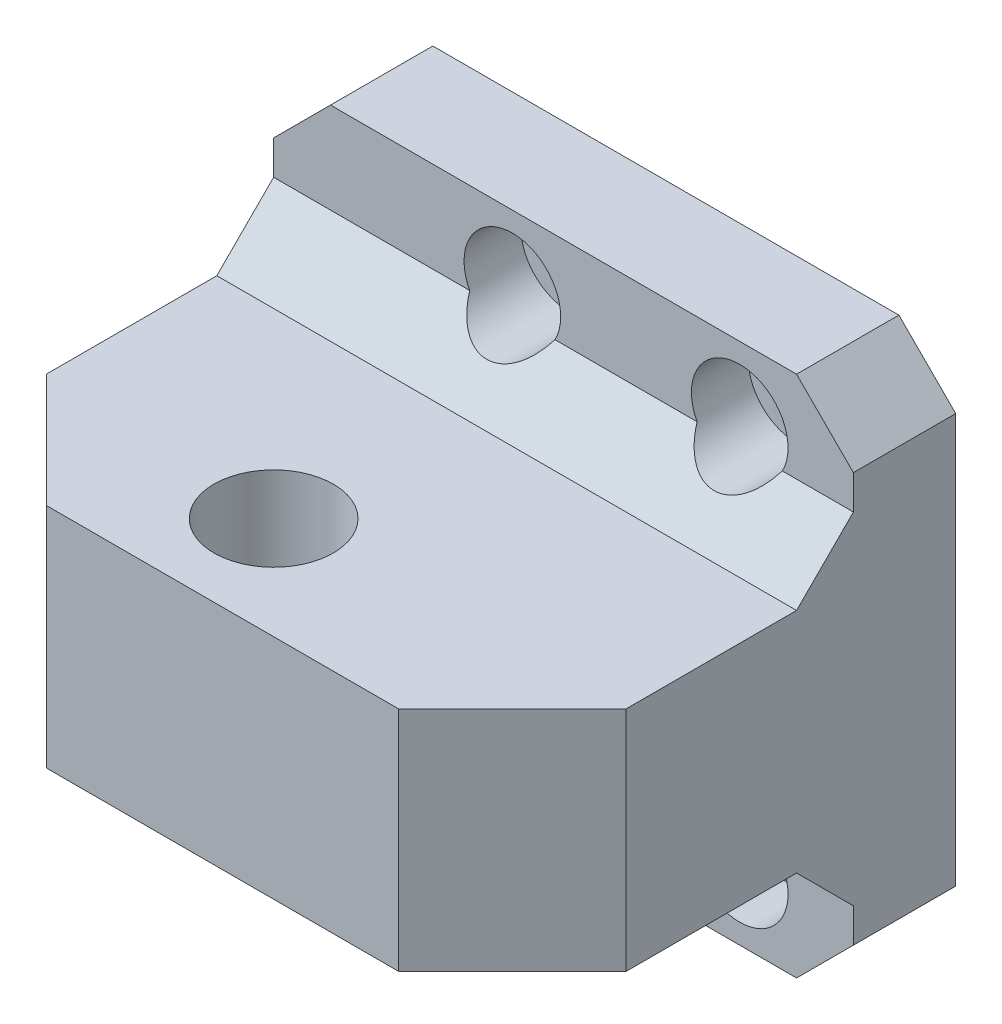
ISO-10303-21;
HEADER;
FILE_DESCRIPTION(('STEP AP214'),'2;1');
FILE_NAME('part.step','',(''),(''),'','','');
FILE_SCHEMA(('AUTOMOTIVE_DESIGN { 1 0 10303 214 1 1 1 1 }'));
ENDSEC;
DATA;
#1=APPLICATION_CONTEXT('core data for automotive mechanical design processes');
#2=APPLICATION_PROTOCOL_DEFINITION('international standard','automotive_design',2000,#1);
#3=PRODUCT_CONTEXT('',#1,'mechanical');
#4=PRODUCT('Part','Part','',(#3));
#5=PRODUCT_RELATED_PRODUCT_CATEGORY('part','',(#4));
#6=PRODUCT_DEFINITION_FORMATION('','',#4);
#7=PRODUCT_DEFINITION_CONTEXT('part definition',#1,'design');
#8=PRODUCT_DEFINITION('design','',#6,#7);
#9=PRODUCT_DEFINITION_SHAPE('','',#8);
#10=(LENGTH_UNIT() NAMED_UNIT(*) SI_UNIT(.MILLI.,.METRE.));
#11=(NAMED_UNIT(*) PLANE_ANGLE_UNIT() SI_UNIT($,.RADIAN.));
#12=(NAMED_UNIT(*) SI_UNIT($,.STERADIAN.) SOLID_ANGLE_UNIT());
#13=UNCERTAINTY_MEASURE_WITH_UNIT(LENGTH_MEASURE(1.E-05),#10,'distance_accuracy_value','');
#14=(GEOMETRIC_REPRESENTATION_CONTEXT(3) GLOBAL_UNCERTAINTY_ASSIGNED_CONTEXT((#13)) GLOBAL_UNIT_ASSIGNED_CONTEXT((#10,
#11,#12)) REPRESENTATION_CONTEXT('',''));
#15=CARTESIAN_POINT('',(0.,0.,0.));
#16=DIRECTION('',(0.,0.,1.));
#17=DIRECTION('',(1.,0.,0.));
#18=AXIS2_PLACEMENT_3D('',#15,#16,#17);
#19=CARTESIAN_POINT('',(0.,0.,9.));
#20=DIRECTION('',(0.,0.,1.));
#21=DIRECTION('',(1.,0.,0.));
#22=AXIS2_PLACEMENT_3D('',#19,#20,#21);
#23=PLANE('',#22);
#24=DIRECTION('',(0.,-1.,0.));
#25=VECTOR('',#24,1.);
#26=CARTESIAN_POINT('',(-21.,23.,9.));
#27=LINE('',#26,#25);
#28=CARTESIAN_POINT('',(-21.,18.,9.));
#29=VERTEX_POINT('',#28);
#30=CARTESIAN_POINT('',(-21.,15.,9.));
#31=VERTEX_POINT('',#30);
#32=EDGE_CURVE('E321',#29,#31,#27,.T.);
#33=ORIENTED_EDGE('',*,*,#32,.T.);
#34=DIRECTION('',(1.,0.,0.));
#35=VECTOR('',#34,1.);
#36=CARTESIAN_POINT('',(0.,15.,9.));
#37=LINE('',#36,#35);
#38=CARTESIAN_POINT('',(-3.75000000000001,15.,9.));
#39=VERTEX_POINT('',#38);
#40=EDGE_CURVE('E279',#31,#39,#37,.T.);
#41=ORIENTED_EDGE('',*,*,#40,.T.);
#42=CARTESIAN_POINT('',(0.,17.,9.));
#43=DIRECTION('',(0.,0.,1.));
#44=DIRECTION('',(1.,0.,0.));
#45=AXIS2_PLACEMENT_3D('',#42,#43,#44);
#46=CIRCLE('',#45,4.25);
#47=CARTESIAN_POINT('',(3.74999999999997,15.,9.));
#48=VERTEX_POINT('',#47);
#49=EDGE_CURVE('E225',#48,#39,#46,.T.);
#50=ORIENTED_EDGE('',*,*,#49,.F.);
#51=DIRECTION('',(1.,0.,0.));
#52=VECTOR('',#51,1.);
#53=CARTESIAN_POINT('',(0.,15.,9.));
#54=LINE('',#53,#52);
#55=CARTESIAN_POINT('',(16.25,15.,9.));
#56=VERTEX_POINT('',#55);
#57=EDGE_CURVE('E277',#48,#56,#54,.T.);
#58=ORIENTED_EDGE('',*,*,#57,.T.);
#59=CARTESIAN_POINT('',(20.,17.,9.));
#60=DIRECTION('',(0.,0.,1.));
#61=DIRECTION('',(1.,0.,0.));
#62=AXIS2_PLACEMENT_3D('',#59,#60,#61);
#63=CIRCLE('',#62,4.25);
#64=CARTESIAN_POINT('',(23.75,15.,9.));
#65=VERTEX_POINT('',#64);
#66=EDGE_CURVE('E374',#65,#56,#63,.T.);
#67=ORIENTED_EDGE('',*,*,#66,.F.);
#68=DIRECTION('',(1.,0.,0.));
#69=VECTOR('',#68,1.);
#70=CARTESIAN_POINT('',(0.,15.,9.));
#71=LINE('',#70,#69);
#72=CARTESIAN_POINT('',(30.,15.,9.));
#73=VERTEX_POINT('',#72);
#74=EDGE_CURVE('E275',#65,#73,#71,.T.);
#75=ORIENTED_EDGE('',*,*,#74,.T.);
#76=DIRECTION('',(0.,1.,0.));
#77=VECTOR('',#76,1.);
#78=CARTESIAN_POINT('',(30.,23.,9.));
#79=LINE('',#78,#77);
#80=CARTESIAN_POINT('',(30.,18.,9.));
#81=VERTEX_POINT('',#80);
#82=EDGE_CURVE('E328',#73,#81,#79,.T.);
#83=ORIENTED_EDGE('',*,*,#82,.T.);
#84=DIRECTION('',(0.707106781186546,-0.707106781186549,0.));
#85=VECTOR('',#84,1.);
#86=CARTESIAN_POINT('',(24.,24.,9.));
#87=LINE('',#86,#85);
#88=CARTESIAN_POINT('',(25.,23.,9.));
#89=VERTEX_POINT('',#88);
#90=EDGE_CURVE('E235',#81,#89,#87,.F.);
#91=ORIENTED_EDGE('',*,*,#90,.T.);
#92=DIRECTION('',(-1.,0.,0.));
#93=VECTOR('',#92,1.);
#94=CARTESIAN_POINT('',(30.,23.,9.));
#95=LINE('',#94,#93);
#96=CARTESIAN_POINT('',(-16.,23.,9.));
#97=VERTEX_POINT('',#96);
#98=EDGE_CURVE('E226',#89,#97,#95,.T.);
#99=ORIENTED_EDGE('',*,*,#98,.T.);
#100=DIRECTION('',(0.707106781186549,0.707106781186547,0.));
#101=VECTOR('',#100,1.);
#102=CARTESIAN_POINT('',(-19.5,19.5,9.));
#103=LINE('',#102,#101);
#104=EDGE_CURVE('E237',#97,#29,#103,.F.);
#105=ORIENTED_EDGE('',*,*,#104,.T.);
#106=EDGE_LOOP('',(#33,#41,#50,#58,#67,#75,#83,#91,#99,#105));
#107=FACE_BOUND('',#106,.T.);
#108=ADVANCED_FACE('F33',(#107),#23,.T.);
#109=CARTESIAN_POINT('',(20.,17.,9.));
#110=DIRECTION('',(0.,0.,-1.));
#111=DIRECTION('',(-1.,0.,0.));
#112=AXIS2_PLACEMENT_3D('',#109,#110,#111);
#113=CYLINDRICAL_SURFACE('',#112,2.75);
#114=CARTESIAN_POINT('',(20.,17.,0.));
#115=DIRECTION('',(0.,0.,1.));
#116=DIRECTION('',(1.,0.,0.));
#117=AXIS2_PLACEMENT_3D('',#114,#115,#116);
#118=CIRCLE('',#117,2.75);
#119=CARTESIAN_POINT('',(22.75,17.,0.));
#120=VERTEX_POINT('',#119);
#121=EDGE_CURVE('E390',#120,#120,#118,.T.);
#122=ORIENTED_EDGE('',*,*,#121,.F.);
#123=EDGE_LOOP('',(#122));
#124=FACE_BOUND('',#123,.T.);
#125=CARTESIAN_POINT('',(20.,17.,4.));
#126=DIRECTION('',(0.,0.,1.));
#127=DIRECTION('',(1.,0.,0.));
#128=AXIS2_PLACEMENT_3D('',#125,#126,#127);
#129=CIRCLE('',#128,2.75);
#130=CARTESIAN_POINT('',(22.75,17.,4.));
#131=VERTEX_POINT('',#130);
#132=EDGE_CURVE('E222',#131,#131,#129,.T.);
#133=ORIENTED_EDGE('',*,*,#132,.T.);
#134=EDGE_LOOP('',(#133));
#135=FACE_BOUND('',#134,.T.);
#136=ADVANCED_FACE('F441',(#124,#135),#113,.F.);
#137=CARTESIAN_POINT('',(20.0000000000003,-17.,9.));
#138=DIRECTION('',(0.,0.,-1.));
#139=DIRECTION('',(-1.,0.,0.));
#140=AXIS2_PLACEMENT_3D('',#137,#138,#139);
#141=CYLINDRICAL_SURFACE('',#140,2.75);
#142=CARTESIAN_POINT('',(20.0000000000003,-17.,0.));
#143=DIRECTION('',(0.,0.,1.));
#144=DIRECTION('',(1.,0.,0.));
#145=AXIS2_PLACEMENT_3D('',#142,#143,#144);
#146=CIRCLE('',#145,2.75);
#147=CARTESIAN_POINT('',(22.7500000000003,-17.,0.));
#148=VERTEX_POINT('',#147);
#149=EDGE_CURVE('E388',#148,#148,#146,.T.);
#150=ORIENTED_EDGE('',*,*,#149,.F.);
#151=EDGE_LOOP('',(#150));
#152=FACE_BOUND('',#151,.T.);
#153=CARTESIAN_POINT('',(20.0000000000003,-17.,4.));
#154=DIRECTION('',(0.,0.,1.));
#155=DIRECTION('',(1.,0.,0.));
#156=AXIS2_PLACEMENT_3D('',#153,#154,#155);
#157=CIRCLE('',#156,2.75);
#158=CARTESIAN_POINT('',(22.7500000000003,-17.,4.));
#159=VERTEX_POINT('',#158);
#160=EDGE_CURVE('E218',#159,#159,#157,.T.);
#161=ORIENTED_EDGE('',*,*,#160,.T.);
#162=EDGE_LOOP('',(#161));
#163=FACE_BOUND('',#162,.T.);
#164=ADVANCED_FACE('F446',(#152,#163),#141,.F.);
#165=CARTESIAN_POINT('',(3.35182208528941E-13,-17.,9.));
#166=DIRECTION('',(0.,0.,-1.));
#167=DIRECTION('',(-1.,0.,0.));
#168=AXIS2_PLACEMENT_3D('',#165,#166,#167);
#169=CYLINDRICAL_SURFACE('',#168,2.75);
#170=CARTESIAN_POINT('',(3.35182208528941E-13,-17.,0.));
#171=DIRECTION('',(0.,0.,1.));
#172=DIRECTION('',(1.,0.,0.));
#173=AXIS2_PLACEMENT_3D('',#170,#171,#172);
#174=CIRCLE('',#173,2.75);
#175=CARTESIAN_POINT('',(2.75000000000033,-17.,0.));
#176=VERTEX_POINT('',#175);
#177=EDGE_CURVE('E213',#176,#176,#174,.T.);
#178=ORIENTED_EDGE('',*,*,#177,.F.);
#179=EDGE_LOOP('',(#178));
#180=FACE_BOUND('',#179,.T.);
#181=CARTESIAN_POINT('',(3.35182208528941E-13,-17.,4.));
#182=DIRECTION('',(0.,0.,1.));
#183=DIRECTION('',(1.,0.,0.));
#184=AXIS2_PLACEMENT_3D('',#181,#182,#183);
#185=CIRCLE('',#184,2.75);
#186=CARTESIAN_POINT('',(2.75000000000033,-17.,4.));
#187=VERTEX_POINT('',#186);
#188=EDGE_CURVE('E215',#187,#187,#185,.T.);
#189=ORIENTED_EDGE('',*,*,#188,.T.);
#190=EDGE_LOOP('',(#189));
#191=FACE_BOUND('',#190,.T.);
#192=ADVANCED_FACE('F400',(#180,#191),#169,.F.);
#193=CARTESIAN_POINT('',(0.,17.,9.));
#194=DIRECTION('',(0.,0.,-1.));
#195=DIRECTION('',(-1.,0.,0.));
#196=AXIS2_PLACEMENT_3D('',#193,#194,#195);
#197=CYLINDRICAL_SURFACE('',#196,2.75);
#198=CARTESIAN_POINT('',(0.,17.,0.));
#199=DIRECTION('',(0.,0.,1.));
#200=DIRECTION('',(1.,0.,0.));
#201=AXIS2_PLACEMENT_3D('',#198,#199,#200);
#202=CIRCLE('',#201,2.75);
#203=CARTESIAN_POINT('',(2.74999999999998,17.,0.));
#204=VERTEX_POINT('',#203);
#205=EDGE_CURVE('E203',#204,#204,#202,.T.);
#206=ORIENTED_EDGE('',*,*,#205,.F.);
#207=EDGE_LOOP('',(#206));
#208=FACE_BOUND('',#207,.T.);
#209=CARTESIAN_POINT('',(0.,17.,4.));
#210=DIRECTION('',(0.,0.,1.));
#211=DIRECTION('',(1.,0.,0.));
#212=AXIS2_PLACEMENT_3D('',#209,#210,#211);
#213=CIRCLE('',#212,2.75);
#214=CARTESIAN_POINT('',(2.74999999999998,17.,4.));
#215=VERTEX_POINT('',#214);
#216=EDGE_CURVE('E210',#215,#215,#213,.T.);
#217=ORIENTED_EDGE('',*,*,#216,.T.);
#218=EDGE_LOOP('',(#217));
#219=FACE_BOUND('',#218,.T.);
#220=ADVANCED_FACE('F397',(#208,#219),#197,.F.);
#221=CARTESIAN_POINT('',(30.,-18.,9.));
#222=VERTEX_POINT('',#221);
#223=CARTESIAN_POINT('',(30.,-15.,9.));
#224=VERTEX_POINT('',#223);
#225=EDGE_CURVE('E329',#222,#224,#79,.T.);
#226=ORIENTED_EDGE('',*,*,#225,.T.);
#227=DIRECTION('',(-1.,0.,0.));
#228=VECTOR('',#227,1.);
#229=CARTESIAN_POINT('',(0.,-15.,9.));
#230=LINE('',#229,#228);
#231=CARTESIAN_POINT('',(23.7500000000003,-15.,9.));
#232=VERTEX_POINT('',#231);
#233=EDGE_CURVE('E287',#224,#232,#230,.T.);
#234=ORIENTED_EDGE('',*,*,#233,.T.);
#235=CARTESIAN_POINT('',(20.0000000000003,-17.,9.));
#236=DIRECTION('',(0.,0.,1.));
#237=DIRECTION('',(1.,0.,0.));
#238=AXIS2_PLACEMENT_3D('',#235,#236,#237);
#239=CIRCLE('',#238,4.25);
#240=CARTESIAN_POINT('',(16.2500000000003,-15.,9.));
#241=VERTEX_POINT('',#240);
#242=EDGE_CURVE('E304',#241,#232,#239,.T.);
#243=ORIENTED_EDGE('',*,*,#242,.F.);
#244=DIRECTION('',(-1.,0.,0.));
#245=VECTOR('',#244,1.);
#246=CARTESIAN_POINT('',(0.,-15.,9.));
#247=LINE('',#246,#245);
#248=CARTESIAN_POINT('',(3.75000000000033,-15.,9.));
#249=VERTEX_POINT('',#248);
#250=EDGE_CURVE('E53',#241,#249,#247,.T.);
#251=ORIENTED_EDGE('',*,*,#250,.T.);
#252=CARTESIAN_POINT('',(3.35668992601512E-13,-17.,9.));
#253=DIRECTION('',(0.,0.,1.));
#254=DIRECTION('',(1.,0.,0.));
#255=AXIS2_PLACEMENT_3D('',#252,#253,#254);
#256=CIRCLE('',#255,4.25);
#257=CARTESIAN_POINT('',(-3.74999999999965,-15.,9.));
#258=VERTEX_POINT('',#257);
#259=EDGE_CURVE('E316',#258,#249,#256,.T.);
#260=ORIENTED_EDGE('',*,*,#259,.F.);
#261=DIRECTION('',(-1.,0.,0.));
#262=VECTOR('',#261,1.);
#263=CARTESIAN_POINT('',(0.,-15.,9.));
#264=LINE('',#263,#262);
#265=CARTESIAN_POINT('',(-21.,-15.,9.));
#266=VERTEX_POINT('',#265);
#267=EDGE_CURVE('E284',#258,#266,#264,.T.);
#268=ORIENTED_EDGE('',*,*,#267,.T.);
#269=CARTESIAN_POINT('',(-21.,-18.,9.));
#270=VERTEX_POINT('',#269);
#271=EDGE_CURVE('E209',#266,#270,#27,.T.);
#272=ORIENTED_EDGE('',*,*,#271,.T.);
#273=DIRECTION('',(-0.707106781186547,0.707106781186548,0.));
#274=VECTOR('',#273,1.);
#275=CARTESIAN_POINT('',(-19.5,-19.5,9.));
#276=LINE('',#275,#274);
#277=CARTESIAN_POINT('',(-16.,-23.,9.));
#278=VERTEX_POINT('',#277);
#279=EDGE_CURVE('E241',#270,#278,#276,.F.);
#280=ORIENTED_EDGE('',*,*,#279,.T.);
#281=DIRECTION('',(1.,0.,0.));
#282=VECTOR('',#281,1.);
#283=CARTESIAN_POINT('',(-21.,-23.,9.));
#284=LINE('',#283,#282);
#285=CARTESIAN_POINT('',(25.,-23.,9.));
#286=VERTEX_POINT('',#285);
#287=EDGE_CURVE('E190',#278,#286,#284,.T.);
#288=ORIENTED_EDGE('',*,*,#287,.T.);
#289=DIRECTION('',(-0.707106781186549,-0.707106781186546,0.));
#290=VECTOR('',#289,1.);
#291=CARTESIAN_POINT('',(23.9999999999999,-24.,9.));
#292=LINE('',#291,#290);
#293=EDGE_CURVE('E239',#286,#222,#292,.F.);
#294=ORIENTED_EDGE('',*,*,#293,.T.);
#295=EDGE_LOOP('',(#226,#234,#243,#251,#260,#268,#272,#280,#288,#294));
#296=FACE_BOUND('',#295,.T.);
#297=ADVANCED_FACE('F308',(#296),#23,.T.);
#298=CARTESIAN_POINT('',(0.,0.,0.));
#299=DIRECTION('',(0.,0.,1.));
#300=DIRECTION('',(1.,0.,0.));
#301=AXIS2_PLACEMENT_3D('',#298,#299,#300);
#302=PLANE('',#301);
#303=DIRECTION('',(1.,0.,0.));
#304=VECTOR('',#303,1.);
#305=CARTESIAN_POINT('',(30.,-23.,0.));
#306=LINE('',#305,#304);
#307=CARTESIAN_POINT('',(-16.,-23.,0.));
#308=VERTEX_POINT('',#307);
#309=CARTESIAN_POINT('',(25.,-23.,0.));
#310=VERTEX_POINT('',#309);
#311=EDGE_CURVE('E187',#308,#310,#306,.T.);
#312=ORIENTED_EDGE('',*,*,#311,.F.);
#313=DIRECTION('',(0.707106781186547,-0.707106781186548,0.));
#314=VECTOR('',#313,1.);
#315=CARTESIAN_POINT('',(-16.,-23.,0.));
#316=LINE('',#315,#314);
#317=CARTESIAN_POINT('',(-21.,-18.,0.));
#318=VERTEX_POINT('',#317);
#319=EDGE_CURVE('E169',#308,#318,#316,.F.);
#320=ORIENTED_EDGE('',*,*,#319,.T.);
#321=DIRECTION('',(0.,-1.,0.));
#322=VECTOR('',#321,1.);
#323=CARTESIAN_POINT('',(-21.,23.,0.));
#324=LINE('',#323,#322);
#325=CARTESIAN_POINT('',(-21.,18.,0.));
#326=VERTEX_POINT('',#325);
#327=EDGE_CURVE('E198',#326,#318,#324,.T.);
#328=ORIENTED_EDGE('',*,*,#327,.F.);
#329=DIRECTION('',(-0.707106781186549,-0.707106781186547,0.));
#330=VECTOR('',#329,1.);
#331=CARTESIAN_POINT('',(-21.,18.,0.));
#332=LINE('',#331,#330);
#333=CARTESIAN_POINT('',(-16.,23.,0.));
#334=VERTEX_POINT('',#333);
#335=EDGE_CURVE('E229',#326,#334,#332,.F.);
#336=ORIENTED_EDGE('',*,*,#335,.T.);
#337=DIRECTION('',(-1.,0.,0.));
#338=VECTOR('',#337,1.);
#339=CARTESIAN_POINT('',(-21.,23.,0.));
#340=LINE('',#339,#338);
#341=CARTESIAN_POINT('',(25.,23.,0.));
#342=VERTEX_POINT('',#341);
#343=EDGE_CURVE('E201',#342,#334,#340,.T.);
#344=ORIENTED_EDGE('',*,*,#343,.F.);
#345=DIRECTION('',(-0.707106781186546,0.707106781186549,0.));
#346=VECTOR('',#345,1.);
#347=CARTESIAN_POINT('',(25.,23.,0.));
#348=LINE('',#347,#346);
#349=CARTESIAN_POINT('',(30.,18.,0.));
#350=VERTEX_POINT('',#349);
#351=EDGE_CURVE('E191',#342,#350,#348,.F.);
#352=ORIENTED_EDGE('',*,*,#351,.T.);
#353=DIRECTION('',(0.,1.,0.));
#354=VECTOR('',#353,1.);
#355=CARTESIAN_POINT('',(30.,23.,0.));
#356=LINE('',#355,#354);
#357=CARTESIAN_POINT('',(30.,-18.,0.));
#358=VERTEX_POINT('',#357);
#359=EDGE_CURVE('E197',#358,#350,#356,.T.);
#360=ORIENTED_EDGE('',*,*,#359,.F.);
#361=DIRECTION('',(0.707106781186549,0.707106781186546,0.));
#362=VECTOR('',#361,1.);
#363=CARTESIAN_POINT('',(30.,-18.,0.));
#364=LINE('',#363,#362);
#365=EDGE_CURVE('E181',#358,#310,#364,.F.);
#366=ORIENTED_EDGE('',*,*,#365,.T.);
#367=EDGE_LOOP('',(#312,#320,#328,#336,#344,#352,#360,#366));
#368=FACE_BOUND('',#367,.T.);
#369=ORIENTED_EDGE('',*,*,#205,.T.);
#370=EDGE_LOOP('',(#369));
#371=FACE_BOUND('',#370,.T.);
#372=ORIENTED_EDGE('',*,*,#121,.T.);
#373=EDGE_LOOP('',(#372));
#374=FACE_BOUND('',#373,.T.);
#375=ORIENTED_EDGE('',*,*,#149,.T.);
#376=EDGE_LOOP('',(#375));
#377=FACE_BOUND('',#376,.T.);
#378=ORIENTED_EDGE('',*,*,#177,.T.);
#379=EDGE_LOOP('',(#378));
#380=FACE_BOUND('',#379,.T.);
#381=ADVANCED_FACE('F194',(#368,#371,#374,#377,#380),#302,.F.);
#382=CARTESIAN_POINT('',(-21.,23.,9.));
#383=DIRECTION('',(1.,0.,0.));
#384=DIRECTION('',(0.,0.,-1.));
#385=AXIS2_PLACEMENT_3D('',#382,#383,#384);
#386=PLANE('',#385);
#387=DIRECTION('',(0.,0.,-1.));
#388=VECTOR('',#387,1.);
#389=CARTESIAN_POINT('',(-21.,-10.,39.));
#390=LINE('',#389,#388);
#391=CARTESIAN_POINT('',(-21.,-10.,29.));
#392=VERTEX_POINT('',#391);
#393=CARTESIAN_POINT('',(-21.,-10.,14.));
#394=VERTEX_POINT('',#393);
#395=EDGE_CURVE('E362',#392,#394,#390,.T.);
#396=ORIENTED_EDGE('',*,*,#395,.F.);
#397=DIRECTION('',(0.,1.,0.));
#398=VECTOR('',#397,1.);
#399=CARTESIAN_POINT('',(-21.,23.,29.));
#400=LINE('',#399,#398);
#401=CARTESIAN_POINT('',(-21.,10.,29.));
#402=VERTEX_POINT('',#401);
#403=EDGE_CURVE('E264',#392,#402,#400,.T.);
#404=ORIENTED_EDGE('',*,*,#403,.T.);
#405=DIRECTION('',(0.,0.,-1.));
#406=VECTOR('',#405,1.);
#407=CARTESIAN_POINT('',(-21.,10.,39.));
#408=LINE('',#407,#406);
#409=CARTESIAN_POINT('',(-21.,10.,14.));
#410=VERTEX_POINT('',#409);
#411=EDGE_CURVE('E368',#402,#410,#408,.T.);
#412=ORIENTED_EDGE('',*,*,#411,.T.);
#413=DIRECTION('',(0.,0.707106781186544,-0.707106781186551));
#414=VECTOR('',#413,1.);
#415=CARTESIAN_POINT('',(-21.,18.9999999999999,4.99999999999999));
#416=LINE('',#415,#414);
#417=EDGE_CURVE('E289',#410,#31,#416,.T.);
#418=ORIENTED_EDGE('',*,*,#417,.T.);
#419=ORIENTED_EDGE('',*,*,#32,.F.);
#420=DIRECTION('',(0.,0.,-1.));
#421=VECTOR('',#420,1.);
#422=CARTESIAN_POINT('',(-21.,18.,9.));
#423=LINE('',#422,#421);
#424=EDGE_CURVE('E180',#29,#326,#423,.T.);
#425=ORIENTED_EDGE('',*,*,#424,.T.);
#426=ORIENTED_EDGE('',*,*,#327,.T.);
#427=DIRECTION('',(0.,0.,1.));
#428=VECTOR('',#427,1.);
#429=CARTESIAN_POINT('',(-21.,-18.,9.));
#430=LINE('',#429,#428);
#431=EDGE_CURVE('E175',#318,#270,#430,.T.);
#432=ORIENTED_EDGE('',*,*,#431,.T.);
#433=ORIENTED_EDGE('',*,*,#271,.F.);
#434=DIRECTION('',(0.,0.707106781186544,0.707106781186551));
#435=VECTOR('',#434,1.);
#436=CARTESIAN_POINT('',(-21.,3.9999999999998,28.));
#437=LINE('',#436,#435);
#438=EDGE_CURVE('E11',#266,#394,#437,.T.);
#439=ORIENTED_EDGE('',*,*,#438,.T.);
#440=EDGE_LOOP('',(#396,#404,#412,#418,#419,#425,#426,#432,#433,#439));
#441=FACE_BOUND('',#440,.T.);
#442=ADVANCED_FACE('F319',(#441),#386,.F.);
#443=CARTESIAN_POINT('',(30.,-23.,9.));
#444=DIRECTION('',(0.,1.,0.));
#445=DIRECTION('',(-1.,0.,0.));
#446=AXIS2_PLACEMENT_3D('',#443,#444,#445);
#447=PLANE('',#446);
#448=ORIENTED_EDGE('',*,*,#287,.F.);
#449=DIRECTION('',(0.,0.,-1.));
#450=VECTOR('',#449,1.);
#451=CARTESIAN_POINT('',(-16.,-23.,9.));
#452=LINE('',#451,#450);
#453=EDGE_CURVE('E173',#278,#308,#452,.T.);
#454=ORIENTED_EDGE('',*,*,#453,.T.);
#455=ORIENTED_EDGE('',*,*,#311,.T.);
#456=DIRECTION('',(0.,0.,1.));
#457=VECTOR('',#456,1.);
#458=CARTESIAN_POINT('',(25.,-23.,9.));
#459=LINE('',#458,#457);
#460=EDGE_CURVE('E192',#310,#286,#459,.T.);
#461=ORIENTED_EDGE('',*,*,#460,.T.);
#462=EDGE_LOOP('',(#448,#454,#455,#461));
#463=FACE_BOUND('',#462,.T.);
#464=ADVANCED_FACE('F186',(#463),#447,.F.);
#465=CARTESIAN_POINT('',(30.,23.,9.));
#466=DIRECTION('',(-1.,0.,0.));
#467=DIRECTION('',(0.,0.,1.));
#468=AXIS2_PLACEMENT_3D('',#465,#466,#467);
#469=PLANE('',#468);
#470=DIRECTION('',(0.,0.,-1.));
#471=VECTOR('',#470,1.);
#472=CARTESIAN_POINT('',(30.,10.,39.));
#473=LINE('',#472,#471);
#474=CARTESIAN_POINT('',(30.,10.,29.));
#475=VERTEX_POINT('',#474);
#476=CARTESIAN_POINT('',(30.,10.,14.));
#477=VERTEX_POINT('',#476);
#478=EDGE_CURVE('E364',#475,#477,#473,.T.);
#479=ORIENTED_EDGE('',*,*,#478,.F.);
#480=DIRECTION('',(0.,-1.,0.));
#481=VECTOR('',#480,1.);
#482=CARTESIAN_POINT('',(30.,23.,29.));
#483=LINE('',#482,#481);
#484=CARTESIAN_POINT('',(30.,-10.,29.));
#485=VERTEX_POINT('',#484);
#486=EDGE_CURVE('E270',#475,#485,#483,.T.);
#487=ORIENTED_EDGE('',*,*,#486,.T.);
#488=DIRECTION('',(0.,0.,-1.));
#489=VECTOR('',#488,1.);
#490=CARTESIAN_POINT('',(30.,-10.,39.));
#491=LINE('',#490,#489);
#492=CARTESIAN_POINT('',(30.,-10.,14.));
#493=VERTEX_POINT('',#492);
#494=EDGE_CURVE('E360',#485,#493,#491,.T.);
#495=ORIENTED_EDGE('',*,*,#494,.T.);
#496=DIRECTION('',(0.,-0.707106781186544,-0.707106781186551));
#497=VECTOR('',#496,1.);
#498=CARTESIAN_POINT('',(30.,3.9999999999998,28.));
#499=LINE('',#498,#497);
#500=EDGE_CURVE('E297',#493,#224,#499,.T.);
#501=ORIENTED_EDGE('',*,*,#500,.T.);
#502=ORIENTED_EDGE('',*,*,#225,.F.);
#503=DIRECTION('',(0.,0.,-1.));
#504=VECTOR('',#503,1.);
#505=CARTESIAN_POINT('',(30.,-18.,9.));
#506=LINE('',#505,#504);
#507=EDGE_CURVE('E246',#222,#358,#506,.T.);
#508=ORIENTED_EDGE('',*,*,#507,.T.);
#509=ORIENTED_EDGE('',*,*,#359,.T.);
#510=DIRECTION('',(0.,0.,1.));
#511=VECTOR('',#510,1.);
#512=CARTESIAN_POINT('',(30.,18.,9.));
#513=LINE('',#512,#511);
#514=EDGE_CURVE('E243',#350,#81,#513,.T.);
#515=ORIENTED_EDGE('',*,*,#514,.T.);
#516=ORIENTED_EDGE('',*,*,#82,.F.);
#517=DIRECTION('',(0.,-0.707106781186544,0.707106781186551));
#518=VECTOR('',#517,1.);
#519=CARTESIAN_POINT('',(30.,18.9999999999999,4.99999999999999));
#520=LINE('',#519,#518);
#521=EDGE_CURVE('E295',#73,#477,#520,.T.);
#522=ORIENTED_EDGE('',*,*,#521,.T.);
#523=EDGE_LOOP('',(#479,#487,#495,#501,#502,#508,#509,#515,#516,#522));
#524=FACE_BOUND('',#523,.T.);
#525=ADVANCED_FACE('F349',(#524),#469,.F.);
#526=CARTESIAN_POINT('',(-21.,23.,9.));
#527=DIRECTION('',(0.,-1.,0.));
#528=DIRECTION('',(1.,0.,0.));
#529=AXIS2_PLACEMENT_3D('',#526,#527,#528);
#530=PLANE('',#529);
#531=ORIENTED_EDGE('',*,*,#343,.T.);
#532=DIRECTION('',(0.,0.,1.));
#533=VECTOR('',#532,1.);
#534=CARTESIAN_POINT('',(-16.,23.,9.));
#535=LINE('',#534,#533);
#536=EDGE_CURVE('E252',#334,#97,#535,.T.);
#537=ORIENTED_EDGE('',*,*,#536,.T.);
#538=ORIENTED_EDGE('',*,*,#98,.F.);
#539=DIRECTION('',(0.,0.,-1.));
#540=VECTOR('',#539,1.);
#541=CARTESIAN_POINT('',(25.,23.,9.));
#542=LINE('',#541,#540);
#543=EDGE_CURVE('E249',#89,#342,#542,.T.);
#544=ORIENTED_EDGE('',*,*,#543,.T.);
#545=EDGE_LOOP('',(#531,#537,#538,#544));
#546=FACE_BOUND('',#545,.T.);
#547=ADVANCED_FACE('F343',(#546),#530,.F.);
#548=CARTESIAN_POINT('',(0.,17.,4.));
#549=DIRECTION('',(0.,0.,1.));
#550=DIRECTION('',(1.,0.,0.));
#551=AXIS2_PLACEMENT_3D('',#548,#549,#550);
#552=CYLINDRICAL_SURFACE('',#551,4.25);
#553=CARTESIAN_POINT('',(0.,17.,4.));
#554=DIRECTION('',(0.,0.,1.));
#555=DIRECTION('',(1.,0.,0.));
#556=AXIS2_PLACEMENT_3D('',#553,#554,#555);
#557=CIRCLE('',#556,4.25);
#558=CARTESIAN_POINT('',(4.24999999999998,17.,4.));
#559=VERTEX_POINT('',#558);
#560=EDGE_CURVE('E214',#559,#559,#557,.T.);
#561=ORIENTED_EDGE('',*,*,#560,.F.);
#562=EDGE_LOOP('',(#561));
#563=FACE_BOUND('',#562,.T.);
#564=ORIENTED_EDGE('',*,*,#49,.T.);
#565=CARTESIAN_POINT('',(0.,17.,6.99999999999996));
#566=DIRECTION('',(0.,-0.707106781186551,-0.707106781186544));
#567=DIRECTION('',(0.,-0.707106781186544,0.707106781186551));
#568=AXIS2_PLACEMENT_3D('',#565,#566,#567);
#569=ELLIPSE('',#568,6.01040764008569,4.25);
#570=EDGE_CURVE('E291',#39,#48,#569,.F.);
#571=ORIENTED_EDGE('',*,*,#570,.T.);
#572=EDGE_LOOP('',(#564,#571));
#573=FACE_BOUND('',#572,.T.);
#574=ADVANCED_FACE('F408',(#563,#573),#552,.F.);
#575=CARTESIAN_POINT('',(0.,17.,4.));
#576=DIRECTION('',(0.,0.,1.));
#577=DIRECTION('',(1.,0.,0.));
#578=AXIS2_PLACEMENT_3D('',#575,#576,#577);
#579=PLANE('',#578);
#580=ORIENTED_EDGE('',*,*,#216,.F.);
#581=EDGE_LOOP('',(#580));
#582=FACE_BOUND('',#581,.T.);
#583=ORIENTED_EDGE('',*,*,#560,.T.);
#584=EDGE_LOOP('',(#583));
#585=FACE_BOUND('',#584,.T.);
#586=ADVANCED_FACE('F404',(#582,#585),#579,.T.);
#587=CARTESIAN_POINT('',(3.35668992601512E-13,-17.,4.));
#588=DIRECTION('',(0.,0.,1.));
#589=DIRECTION('',(1.,0.,0.));
#590=AXIS2_PLACEMENT_3D('',#587,#588,#589);
#591=CYLINDRICAL_SURFACE('',#590,4.25);
#592=CARTESIAN_POINT('',(3.35668992601512E-13,-17.,4.));
#593=DIRECTION('',(0.,0.,1.));
#594=DIRECTION('',(1.,0.,0.));
#595=AXIS2_PLACEMENT_3D('',#592,#593,#594);
#596=CIRCLE('',#595,4.25);
#597=CARTESIAN_POINT('',(4.25000000000034,-17.,4.));
#598=VERTEX_POINT('',#597);
#599=EDGE_CURVE('E310',#598,#598,#596,.T.);
#600=ORIENTED_EDGE('',*,*,#599,.F.);
#601=EDGE_LOOP('',(#600));
#602=FACE_BOUND('',#601,.T.);
#603=ORIENTED_EDGE('',*,*,#259,.T.);
#604=CARTESIAN_POINT('',(3.35668992601512E-13,-17.,6.99999999999996));
#605=DIRECTION('',(0.,0.707106781186551,-0.707106781186544));
#606=DIRECTION('',(0.,0.707106781186544,0.707106781186551));
#607=AXIS2_PLACEMENT_3D('',#604,#605,#606);
#608=ELLIPSE('',#607,6.01040764008569,4.25);
#609=EDGE_CURVE('E41',#249,#258,#608,.F.);
#610=ORIENTED_EDGE('',*,*,#609,.T.);
#611=EDGE_LOOP('',(#603,#610));
#612=FACE_BOUND('',#611,.T.);
#613=ADVANCED_FACE('F407',(#602,#612),#591,.F.);
#614=CARTESIAN_POINT('',(3.35668992601512E-13,-17.,4.));
#615=DIRECTION('',(0.,0.,1.));
#616=DIRECTION('',(1.,0.,0.));
#617=AXIS2_PLACEMENT_3D('',#614,#615,#616);
#618=PLANE('',#617);
#619=ORIENTED_EDGE('',*,*,#188,.F.);
#620=EDGE_LOOP('',(#619));
#621=FACE_BOUND('',#620,.T.);
#622=ORIENTED_EDGE('',*,*,#599,.T.);
#623=EDGE_LOOP('',(#622));
#624=FACE_BOUND('',#623,.T.);
#625=ADVANCED_FACE('F530',(#621,#624),#618,.T.);
#626=CARTESIAN_POINT('',(20.0000000000003,-17.,4.));
#627=DIRECTION('',(0.,0.,1.));
#628=DIRECTION('',(1.,0.,0.));
#629=AXIS2_PLACEMENT_3D('',#626,#627,#628);
#630=CYLINDRICAL_SURFACE('',#629,4.25);
#631=CARTESIAN_POINT('',(20.0000000000003,-17.,4.));
#632=DIRECTION('',(0.,0.,1.));
#633=DIRECTION('',(1.,0.,0.));
#634=AXIS2_PLACEMENT_3D('',#631,#632,#633);
#635=CIRCLE('',#634,4.25);
#636=CARTESIAN_POINT('',(24.2500000000003,-17.,4.));
#637=VERTEX_POINT('',#636);
#638=EDGE_CURVE('E309',#637,#637,#635,.T.);
#639=ORIENTED_EDGE('',*,*,#638,.F.);
#640=EDGE_LOOP('',(#639));
#641=FACE_BOUND('',#640,.T.);
#642=ORIENTED_EDGE('',*,*,#242,.T.);
#643=CARTESIAN_POINT('',(20.0000000000003,-17.,6.99999999999996));
#644=DIRECTION('',(0.,0.707106781186551,-0.707106781186544));
#645=DIRECTION('',(0.,0.707106781186544,0.707106781186551));
#646=AXIS2_PLACEMENT_3D('',#643,#644,#645);
#647=ELLIPSE('',#646,6.01040764008569,4.25);
#648=EDGE_CURVE('E299',#232,#241,#647,.F.);
#649=ORIENTED_EDGE('',*,*,#648,.T.);
#650=EDGE_LOOP('',(#642,#649));
#651=FACE_BOUND('',#650,.T.);
#652=ADVANCED_FACE('F303',(#641,#651),#630,.F.);
#653=CARTESIAN_POINT('',(20.0000000000003,-17.,4.));
#654=DIRECTION('',(0.,0.,1.));
#655=DIRECTION('',(1.,0.,0.));
#656=AXIS2_PLACEMENT_3D('',#653,#654,#655);
#657=PLANE('',#656);
#658=ORIENTED_EDGE('',*,*,#160,.F.);
#659=EDGE_LOOP('',(#658));
#660=FACE_BOUND('',#659,.T.);
#661=ORIENTED_EDGE('',*,*,#638,.T.);
#662=EDGE_LOOP('',(#661));
#663=FACE_BOUND('',#662,.T.);
#664=ADVANCED_FACE('F428',(#660,#663),#657,.T.);
#665=CARTESIAN_POINT('',(20.,17.,4.));
#666=DIRECTION('',(0.,0.,1.));
#667=DIRECTION('',(1.,0.,0.));
#668=AXIS2_PLACEMENT_3D('',#665,#666,#667);
#669=CYLINDRICAL_SURFACE('',#668,4.25);
#670=CARTESIAN_POINT('',(20.,17.,4.));
#671=DIRECTION('',(0.,0.,1.));
#672=DIRECTION('',(1.,0.,0.));
#673=AXIS2_PLACEMENT_3D('',#670,#671,#672);
#674=CIRCLE('',#673,4.25);
#675=CARTESIAN_POINT('',(24.25,17.,4.));
#676=VERTEX_POINT('',#675);
#677=EDGE_CURVE('E219',#676,#676,#674,.T.);
#678=ORIENTED_EDGE('',*,*,#677,.F.);
#679=EDGE_LOOP('',(#678));
#680=FACE_BOUND('',#679,.T.);
#681=ORIENTED_EDGE('',*,*,#66,.T.);
#682=CARTESIAN_POINT('',(20.,17.,6.99999999999996));
#683=DIRECTION('',(0.,-0.707106781186551,-0.707106781186544));
#684=DIRECTION('',(0.,-0.707106781186544,0.707106781186551));
#685=AXIS2_PLACEMENT_3D('',#682,#683,#684);
#686=ELLIPSE('',#685,6.01040764008569,4.25);
#687=EDGE_CURVE('E293',#56,#65,#686,.F.);
#688=ORIENTED_EDGE('',*,*,#687,.T.);
#689=EDGE_LOOP('',(#681,#688));
#690=FACE_BOUND('',#689,.T.);
#691=ADVANCED_FACE('F425',(#680,#690),#669,.F.);
#692=CARTESIAN_POINT('',(20.,17.,4.));
#693=DIRECTION('',(0.,0.,1.));
#694=DIRECTION('',(1.,0.,0.));
#695=AXIS2_PLACEMENT_3D('',#692,#693,#694);
#696=PLANE('',#695);
#697=ORIENTED_EDGE('',*,*,#132,.F.);
#698=EDGE_LOOP('',(#697));
#699=FACE_BOUND('',#698,.T.);
#700=ORIENTED_EDGE('',*,*,#677,.T.);
#701=EDGE_LOOP('',(#700));
#702=FACE_BOUND('',#701,.T.);
#703=ADVANCED_FACE('F427',(#699,#702),#696,.T.);
#704=CARTESIAN_POINT('',(-16.,-23.,9.));
#705=DIRECTION('',(0.707106781186548,0.707106781186547,0.));
#706=DIRECTION('',(0.,0.,-1.));
#707=AXIS2_PLACEMENT_3D('',#704,#705,#706);
#708=PLANE('',#707);
#709=ORIENTED_EDGE('',*,*,#279,.F.);
#710=ORIENTED_EDGE('',*,*,#431,.F.);
#711=ORIENTED_EDGE('',*,*,#319,.F.);
#712=ORIENTED_EDGE('',*,*,#453,.F.);
#713=EDGE_LOOP('',(#709,#710,#711,#712));
#714=FACE_BOUND('',#713,.T.);
#715=ADVANCED_FACE('F172',(#714),#708,.F.);
#716=CARTESIAN_POINT('',(30.,-18.,9.));
#717=DIRECTION('',(-0.707106781186546,0.707106781186549,0.));
#718=DIRECTION('',(0.,0.,-1.));
#719=AXIS2_PLACEMENT_3D('',#716,#717,#718);
#720=PLANE('',#719);
#721=ORIENTED_EDGE('',*,*,#293,.F.);
#722=ORIENTED_EDGE('',*,*,#460,.F.);
#723=ORIENTED_EDGE('',*,*,#365,.F.);
#724=ORIENTED_EDGE('',*,*,#507,.F.);
#725=EDGE_LOOP('',(#721,#722,#723,#724));
#726=FACE_BOUND('',#725,.T.);
#727=ADVANCED_FACE('F355',(#726),#720,.F.);
#728=CARTESIAN_POINT('',(-21.,18.,9.));
#729=DIRECTION('',(0.707106781186546,-0.707106781186548,0.));
#730=DIRECTION('',(0.,0.,-1.));
#731=AXIS2_PLACEMENT_3D('',#728,#729,#730);
#732=PLANE('',#731);
#733=ORIENTED_EDGE('',*,*,#104,.F.);
#734=ORIENTED_EDGE('',*,*,#536,.F.);
#735=ORIENTED_EDGE('',*,*,#335,.F.);
#736=ORIENTED_EDGE('',*,*,#424,.F.);
#737=EDGE_LOOP('',(#733,#734,#735,#736));
#738=FACE_BOUND('',#737,.T.);
#739=ADVANCED_FACE('F341',(#738),#732,.F.);
#740=CARTESIAN_POINT('',(25.,23.,9.));
#741=DIRECTION('',(-0.707106781186549,-0.707106781186546,0.));
#742=DIRECTION('',(0.,0.,-1.));
#743=AXIS2_PLACEMENT_3D('',#740,#741,#742);
#744=PLANE('',#743);
#745=ORIENTED_EDGE('',*,*,#90,.F.);
#746=ORIENTED_EDGE('',*,*,#514,.F.);
#747=ORIENTED_EDGE('',*,*,#351,.F.);
#748=ORIENTED_EDGE('',*,*,#543,.F.);
#749=EDGE_LOOP('',(#745,#746,#747,#748));
#750=FACE_BOUND('',#749,.T.);
#751=ADVANCED_FACE('F345',(#750),#744,.F.);
#752=CARTESIAN_POINT('',(-21.,-10.,39.));
#753=DIRECTION('',(0.,1.,0.));
#754=DIRECTION('',(-1.,0.,0.));
#755=AXIS2_PLACEMENT_3D('',#752,#753,#754);
#756=PLANE('',#755);
#757=CARTESIAN_POINT('',(0.,-10.,30.));
#758=DIRECTION('',(0.,1.,0.));
#759=DIRECTION('',(-1.,0.,0.));
#760=AXIS2_PLACEMENT_3D('',#757,#758,#759);
#761=CIRCLE('',#760,5.25);
#762=CARTESIAN_POINT('',(-5.25,-10.,30.));
#763=VERTEX_POINT('',#762);
#764=EDGE_CURVE('E721',#763,#763,#761,.T.);
#765=ORIENTED_EDGE('',*,*,#764,.T.);
#766=EDGE_LOOP('',(#765));
#767=FACE_BOUND('',#766,.T.);
#768=ORIENTED_EDGE('',*,*,#395,.T.);
#769=DIRECTION('',(1.,0.,0.));
#770=VECTOR('',#769,1.);
#771=CARTESIAN_POINT('',(-21.,-10.,14.));
#772=LINE('',#771,#770);
#773=EDGE_CURVE('E281',#394,#493,#772,.T.);
#774=ORIENTED_EDGE('',*,*,#773,.T.);
#775=ORIENTED_EDGE('',*,*,#494,.F.);
#776=DIRECTION('',(0.707106781186546,0.,-0.707106781186549));
#777=VECTOR('',#776,1.);
#778=CARTESIAN_POINT('',(20.,-10.,39.));
#779=LINE('',#778,#777);
#780=CARTESIAN_POINT('',(20.,-10.,39.));
#781=VERTEX_POINT('',#780);
#782=EDGE_CURVE('E260',#485,#781,#779,.F.);
#783=ORIENTED_EDGE('',*,*,#782,.T.);
#784=DIRECTION('',(1.,0.,0.));
#785=VECTOR('',#784,1.);
#786=CARTESIAN_POINT('',(-21.,-10.,39.));
#787=LINE('',#786,#785);
#788=CARTESIAN_POINT('',(-11.,-10.,39.));
#789=VERTEX_POINT('',#788);
#790=EDGE_CURVE('E722',#789,#781,#787,.T.);
#791=ORIENTED_EDGE('',*,*,#790,.F.);
#792=DIRECTION('',(0.707106781186547,0.,0.707106781186549));
#793=VECTOR('',#792,1.);
#794=CARTESIAN_POINT('',(-11.,-10.,39.));
#795=LINE('',#794,#793);
#796=EDGE_CURVE('E262',#789,#392,#795,.F.);
#797=ORIENTED_EDGE('',*,*,#796,.T.);
#798=EDGE_LOOP('',(#768,#774,#775,#783,#791,#797));
#799=FACE_BOUND('',#798,.T.);
#800=ADVANCED_FACE('F359',(#767,#799),#756,.F.);
#801=CARTESIAN_POINT('',(-21.,10.,39.));
#802=DIRECTION('',(0.,-1.,0.));
#803=DIRECTION('',(1.,0.,0.));
#804=AXIS2_PLACEMENT_3D('',#801,#802,#803);
#805=PLANE('',#804);
#806=CARTESIAN_POINT('',(0.,10.,30.));
#807=DIRECTION('',(0.,1.,0.));
#808=DIRECTION('',(-1.,0.,0.));
#809=AXIS2_PLACEMENT_3D('',#806,#807,#808);
#810=CIRCLE('',#809,5.25);
#811=CARTESIAN_POINT('',(-5.25,10.,30.));
#812=VERTEX_POINT('',#811);
#813=EDGE_CURVE('E718',#812,#812,#810,.T.);
#814=ORIENTED_EDGE('',*,*,#813,.F.);
#815=EDGE_LOOP('',(#814));
#816=FACE_BOUND('',#815,.T.);
#817=ORIENTED_EDGE('',*,*,#478,.T.);
#818=DIRECTION('',(-1.,0.,0.));
#819=VECTOR('',#818,1.);
#820=CARTESIAN_POINT('',(-21.,10.,14.));
#821=LINE('',#820,#819);
#822=EDGE_CURVE('E272',#477,#410,#821,.T.);
#823=ORIENTED_EDGE('',*,*,#822,.T.);
#824=ORIENTED_EDGE('',*,*,#411,.F.);
#825=DIRECTION('',(-0.707106781186547,0.,-0.707106781186549));
#826=VECTOR('',#825,1.);
#827=CARTESIAN_POINT('',(-11.,10.,39.));
#828=LINE('',#827,#826);
#829=CARTESIAN_POINT('',(-11.,10.,39.));
#830=VERTEX_POINT('',#829);
#831=EDGE_CURVE('E268',#402,#830,#828,.F.);
#832=ORIENTED_EDGE('',*,*,#831,.T.);
#833=DIRECTION('',(-1.,0.,0.));
#834=VECTOR('',#833,1.);
#835=CARTESIAN_POINT('',(-21.,10.,39.));
#836=LINE('',#835,#834);
#837=CARTESIAN_POINT('',(20.,10.,39.));
#838=VERTEX_POINT('',#837);
#839=EDGE_CURVE('E725',#838,#830,#836,.T.);
#840=ORIENTED_EDGE('',*,*,#839,.F.);
#841=DIRECTION('',(-0.707106781186546,0.,0.707106781186549));
#842=VECTOR('',#841,1.);
#843=CARTESIAN_POINT('',(20.,10.,39.));
#844=LINE('',#843,#842);
#845=EDGE_CURVE('E266',#838,#475,#844,.F.);
#846=ORIENTED_EDGE('',*,*,#845,.T.);
#847=EDGE_LOOP('',(#817,#823,#824,#832,#840,#846));
#848=FACE_BOUND('',#847,.T.);
#849=ADVANCED_FACE('F497',(#816,#848),#805,.F.);
#850=CARTESIAN_POINT('',(0.,0.,39.));
#851=DIRECTION('',(0.,0.,-1.));
#852=DIRECTION('',(-1.,0.,0.));
#853=AXIS2_PLACEMENT_3D('',#850,#851,#852);
#854=PLANE('',#853);
#855=ORIENTED_EDGE('',*,*,#839,.T.);
#856=DIRECTION('',(0.,-1.,0.));
#857=VECTOR('',#856,1.);
#858=CARTESIAN_POINT('',(-11.,0.,39.));
#859=LINE('',#858,#857);
#860=EDGE_CURVE('E257',#830,#789,#859,.T.);
#861=ORIENTED_EDGE('',*,*,#860,.T.);
#862=ORIENTED_EDGE('',*,*,#790,.T.);
#863=DIRECTION('',(0.,1.,0.));
#864=VECTOR('',#863,1.);
#865=CARTESIAN_POINT('',(20.,0.,39.));
#866=LINE('',#865,#864);
#867=EDGE_CURVE('E254',#781,#838,#866,.T.);
#868=ORIENTED_EDGE('',*,*,#867,.T.);
#869=EDGE_LOOP('',(#855,#861,#862,#868));
#870=FACE_BOUND('',#869,.T.);
#871=ADVANCED_FACE('F502',(#870),#854,.F.);
#872=CARTESIAN_POINT('',(0.,-23.,30.));
#873=DIRECTION('',(0.,1.,0.));
#874=DIRECTION('',(-1.,0.,0.));
#875=AXIS2_PLACEMENT_3D('',#872,#873,#874);
#876=CYLINDRICAL_SURFACE('',#875,5.25);
#877=ORIENTED_EDGE('',*,*,#813,.T.);
#878=EDGE_LOOP('',(#877));
#879=FACE_BOUND('',#878,.T.);
#880=ORIENTED_EDGE('',*,*,#764,.F.);
#881=EDGE_LOOP('',(#880));
#882=FACE_BOUND('',#881,.T.);
#883=ADVANCED_FACE('F477',(#879,#882),#876,.F.);
#884=CARTESIAN_POINT('',(-11.,0.,39.));
#885=DIRECTION('',(0.707106781186549,0.,-0.707106781186547));
#886=DIRECTION('',(0.,-1.,0.));
#887=AXIS2_PLACEMENT_3D('',#884,#885,#886);
#888=PLANE('',#887);
#889=ORIENTED_EDGE('',*,*,#831,.F.);
#890=ORIENTED_EDGE('',*,*,#403,.F.);
#891=ORIENTED_EDGE('',*,*,#796,.F.);
#892=ORIENTED_EDGE('',*,*,#860,.F.);
#893=EDGE_LOOP('',(#889,#890,#891,#892));
#894=FACE_BOUND('',#893,.T.);
#895=ADVANCED_FACE('F473',(#894),#888,.F.);
#896=CARTESIAN_POINT('',(20.,0.,39.));
#897=DIRECTION('',(-0.707106781186549,0.,-0.707106781186546));
#898=DIRECTION('',(0.,1.,0.));
#899=AXIS2_PLACEMENT_3D('',#896,#897,#898);
#900=PLANE('',#899);
#901=ORIENTED_EDGE('',*,*,#782,.F.);
#902=ORIENTED_EDGE('',*,*,#486,.F.);
#903=ORIENTED_EDGE('',*,*,#845,.F.);
#904=ORIENTED_EDGE('',*,*,#867,.F.);
#905=EDGE_LOOP('',(#901,#902,#903,#904));
#906=FACE_BOUND('',#905,.T.);
#907=ADVANCED_FACE('F476',(#906),#900,.F.);
#908=CARTESIAN_POINT('',(-21.,10.,14.));
#909=DIRECTION('',(0.,-0.707106781186551,-0.707106781186544));
#910=DIRECTION('',(-1.,0.,0.));
#911=AXIS2_PLACEMENT_3D('',#908,#909,#910);
#912=PLANE('',#911);
#913=ORIENTED_EDGE('',*,*,#570,.F.);
#914=ORIENTED_EDGE('',*,*,#40,.F.);
#915=ORIENTED_EDGE('',*,*,#417,.F.);
#916=ORIENTED_EDGE('',*,*,#822,.F.);
#917=ORIENTED_EDGE('',*,*,#521,.F.);
#918=ORIENTED_EDGE('',*,*,#74,.F.);
#919=ORIENTED_EDGE('',*,*,#687,.F.);
#920=ORIENTED_EDGE('',*,*,#57,.F.);
#921=EDGE_LOOP('',(#913,#914,#915,#916,#917,#918,#919,#920));
#922=FACE_BOUND('',#921,.T.);
#923=ADVANCED_FACE('F420',(#922),#912,.F.);
#924=CARTESIAN_POINT('',(-21.,-10.,14.));
#925=DIRECTION('',(0.,0.707106781186551,-0.707106781186544));
#926=DIRECTION('',(1.,0.,0.));
#927=AXIS2_PLACEMENT_3D('',#924,#925,#926);
#928=PLANE('',#927);
#929=ORIENTED_EDGE('',*,*,#648,.F.);
#930=ORIENTED_EDGE('',*,*,#233,.F.);
#931=ORIENTED_EDGE('',*,*,#500,.F.);
#932=ORIENTED_EDGE('',*,*,#773,.F.);
#933=ORIENTED_EDGE('',*,*,#438,.F.);
#934=ORIENTED_EDGE('',*,*,#267,.F.);
#935=ORIENTED_EDGE('',*,*,#609,.F.);
#936=ORIENTED_EDGE('',*,*,#250,.F.);
#937=EDGE_LOOP('',(#929,#930,#931,#932,#933,#934,#935,#936));
#938=FACE_BOUND('',#937,.T.);
#939=ADVANCED_FACE('F35',(#938),#928,.F.);
#940=CLOSED_SHELL('',(#108,#136,#164,#192,#220,#297,#381,#442,#464,#525,#547,#574,#586,#613,
#625,#652,#664,#691,#703,#715,#727,#739,#751,#800,#849,#871,#883,#895,#907,#923,#939));
#941=MANIFOLD_SOLID_BREP('B2',#940);
#942=ADVANCED_BREP_SHAPE_REPRESENTATION('',(#18,#941),#14);
#943=SHAPE_DEFINITION_REPRESENTATION(#9,#942);
ENDSEC;
END-ISO-10303-21;
